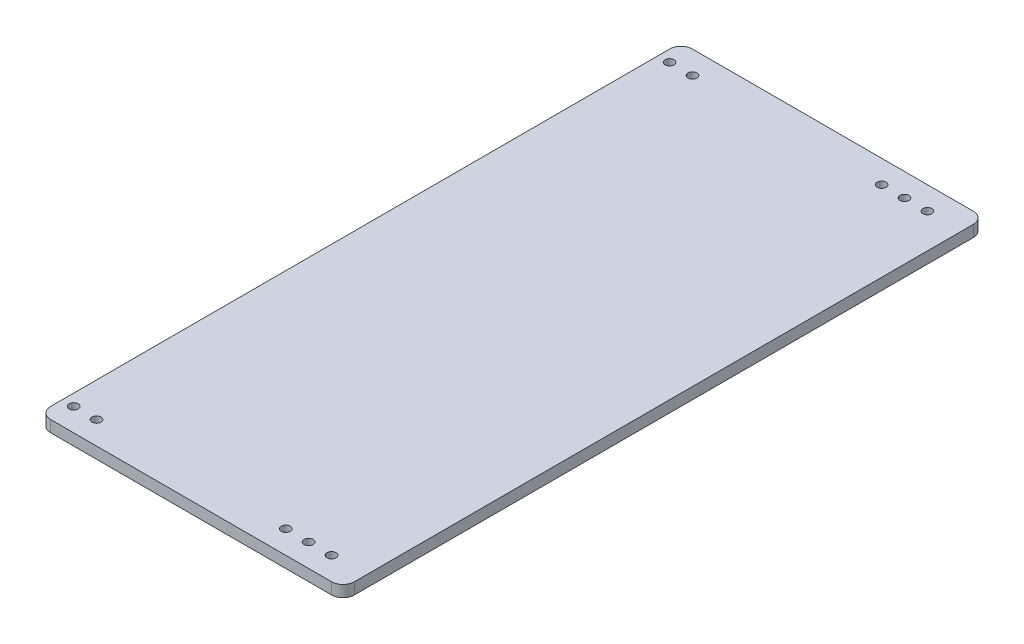
ISO-10303-21;
HEADER;
FILE_DESCRIPTION(('STEP AP214'),'2;1');
FILE_NAME('part.step','',(''),(''),'','','');
FILE_SCHEMA(('AUTOMOTIVE_DESIGN { 1 0 10303 214 1 1 1 1 }'));
ENDSEC;
DATA;
#1=APPLICATION_CONTEXT('core data for automotive mechanical design processes');
#2=APPLICATION_PROTOCOL_DEFINITION('international standard','automotive_design',2000,#1);
#3=PRODUCT_CONTEXT('',#1,'mechanical');
#4=PRODUCT('Part','Part','',(#3));
#5=PRODUCT_RELATED_PRODUCT_CATEGORY('part','',(#4));
#6=PRODUCT_DEFINITION_FORMATION('','',#4);
#7=PRODUCT_DEFINITION_CONTEXT('part definition',#1,'design');
#8=PRODUCT_DEFINITION('design','',#6,#7);
#9=PRODUCT_DEFINITION_SHAPE('','',#8);
#10=(LENGTH_UNIT() NAMED_UNIT(*) SI_UNIT(.MILLI.,.METRE.));
#11=(NAMED_UNIT(*) PLANE_ANGLE_UNIT() SI_UNIT($,.RADIAN.));
#12=(NAMED_UNIT(*) SI_UNIT($,.STERADIAN.) SOLID_ANGLE_UNIT());
#13=UNCERTAINTY_MEASURE_WITH_UNIT(LENGTH_MEASURE(1.E-05),#10,'distance_accuracy_value','');
#14=(GEOMETRIC_REPRESENTATION_CONTEXT(3) GLOBAL_UNCERTAINTY_ASSIGNED_CONTEXT((#13)) GLOBAL_UNIT_ASSIGNED_CONTEXT((#10,
#11,#12)) REPRESENTATION_CONTEXT('',''));
#15=CARTESIAN_POINT('',(0.,0.,0.));
#16=DIRECTION('',(0.,0.,1.));
#17=DIRECTION('',(1.,0.,0.));
#18=AXIS2_PLACEMENT_3D('',#15,#16,#17);
#19=CARTESIAN_POINT('',(0.,6.35,0.));
#20=DIRECTION('',(0.,-1.,0.));
#21=DIRECTION('',(0.,0.,-1.));
#22=AXIS2_PLACEMENT_3D('',#19,#20,#21);
#23=PLANE('',#22);
#24=CARTESIAN_POINT('',(39.6875,6.35,165.1));
#25=DIRECTION('',(0.,1.,0.));
#26=DIRECTION('',(0.,0.,1.));
#27=AXIS2_PLACEMENT_3D('',#24,#25,#26);
#28=CIRCLE('',#27,2.48920000000002);
#29=CARTESIAN_POINT('',(39.6875,6.35,167.5892));
#30=VERTEX_POINT('',#29);
#31=EDGE_CURVE('E223',#30,#30,#28,.T.);
#32=ORIENTED_EDGE('',*,*,#31,.F.);
#33=EDGE_LOOP('',(#32));
#34=FACE_BOUND('',#33,.T.);
#35=CARTESIAN_POINT('',(-77.7875,6.35,-165.1));
#36=DIRECTION('',(0.,1.,0.));
#37=DIRECTION('',(0.,0.,1.));
#38=AXIS2_PLACEMENT_3D('',#35,#36,#37);
#39=CIRCLE('',#38,2.48920000000002);
#40=CARTESIAN_POINT('',(-77.7875,6.35,-162.6108));
#41=VERTEX_POINT('',#40);
#42=EDGE_CURVE('E205',#41,#41,#39,.T.);
#43=ORIENTED_EDGE('',*,*,#42,.F.);
#44=EDGE_LOOP('',(#43));
#45=FACE_BOUND('',#44,.T.);
#46=CARTESIAN_POINT('',(-77.7874999999999,6.35,165.1));
#47=DIRECTION('',(0.,1.,0.));
#48=DIRECTION('',(0.,0.,1.));
#49=AXIS2_PLACEMENT_3D('',#46,#47,#48);
#50=CIRCLE('',#49,2.48920000000002);
#51=CARTESIAN_POINT('',(-77.7874999999999,6.35,167.5892));
#52=VERTEX_POINT('',#51);
#53=EDGE_CURVE('E187',#52,#52,#50,.F.);
#54=ORIENTED_EDGE('',*,*,#53,.T.);
#55=EDGE_LOOP('',(#54));
#56=FACE_BOUND('',#55,.T.);
#57=CARTESIAN_POINT('',(65.0875,6.35,-165.1));
#58=DIRECTION('',(0.,1.,0.));
#59=DIRECTION('',(0.,0.,1.));
#60=AXIS2_PLACEMENT_3D('',#57,#58,#59);
#61=CIRCLE('',#60,2.48920000000002);
#62=CARTESIAN_POINT('',(65.0875,6.35,-162.6108));
#63=VERTEX_POINT('',#62);
#64=EDGE_CURVE('E192',#63,#63,#61,.F.);
#65=ORIENTED_EDGE('',*,*,#64,.T.);
#66=EDGE_LOOP('',(#65));
#67=FACE_BOUND('',#66,.T.);
#68=CARTESIAN_POINT('',(52.3875,6.35,-165.1));
#69=DIRECTION('',(0.,1.,0.));
#70=DIRECTION('',(0.,0.,1.));
#71=AXIS2_PLACEMENT_3D('',#68,#69,#70);
#72=CIRCLE('',#71,2.48920000000002);
#73=CARTESIAN_POINT('',(52.3875,6.35,-162.6108));
#74=VERTEX_POINT('',#73);
#75=EDGE_CURVE('E193',#74,#74,#72,.F.);
#76=ORIENTED_EDGE('',*,*,#75,.T.);
#77=EDGE_LOOP('',(#76));
#78=FACE_BOUND('',#77,.T.);
#79=CARTESIAN_POINT('',(39.6875,6.35,-165.1));
#80=DIRECTION('',(0.,1.,0.));
#81=DIRECTION('',(0.,0.,1.));
#82=AXIS2_PLACEMENT_3D('',#79,#80,#81);
#83=CIRCLE('',#82,2.48920000000002);
#84=CARTESIAN_POINT('',(39.6875,6.35,-162.6108));
#85=VERTEX_POINT('',#84);
#86=EDGE_CURVE('E204',#85,#85,#83,.F.);
#87=ORIENTED_EDGE('',*,*,#86,.T.);
#88=EDGE_LOOP('',(#87));
#89=FACE_BOUND('',#88,.T.);
#90=DIRECTION('',(1.,0.,0.));
#91=VECTOR('',#90,1.);
#92=CARTESIAN_POINT('',(-84.1375,6.35,177.8));
#93=LINE('',#92,#91);
#94=CARTESIAN_POINT('',(-77.7875,6.35,177.8));
#95=VERTEX_POINT('',#94);
#96=CARTESIAN_POINT('',(77.7875,6.35,177.8));
#97=VERTEX_POINT('',#96);
#98=EDGE_CURVE('E142',#95,#97,#93,.T.);
#99=ORIENTED_EDGE('',*,*,#98,.T.);
#100=CARTESIAN_POINT('',(77.7875,6.35,171.45));
#101=DIRECTION('',(0.,-1.,0.));
#102=DIRECTION('',(0.,0.,-1.));
#103=AXIS2_PLACEMENT_3D('',#100,#101,#102);
#104=CIRCLE('',#103,6.35);
#105=CARTESIAN_POINT('',(84.1375,6.35,171.45));
#106=VERTEX_POINT('',#105);
#107=EDGE_CURVE('E161',#97,#106,#104,.F.);
#108=ORIENTED_EDGE('',*,*,#107,.T.);
#109=DIRECTION('',(0.,0.,-1.));
#110=VECTOR('',#109,1.);
#111=CARTESIAN_POINT('',(84.1375,6.35,177.8));
#112=LINE('',#111,#110);
#113=CARTESIAN_POINT('',(84.1375,6.35,-171.45));
#114=VERTEX_POINT('',#113);
#115=EDGE_CURVE('E125',#106,#114,#112,.T.);
#116=ORIENTED_EDGE('',*,*,#115,.T.);
#117=CARTESIAN_POINT('',(77.7875,6.35,-171.45));
#118=DIRECTION('',(0.,-1.,0.));
#119=DIRECTION('',(0.,0.,-1.));
#120=AXIS2_PLACEMENT_3D('',#117,#118,#119);
#121=CIRCLE('',#120,6.35);
#122=CARTESIAN_POINT('',(77.7875,6.35,-177.8));
#123=VERTEX_POINT('',#122);
#124=EDGE_CURVE('E156',#114,#123,#121,.F.);
#125=ORIENTED_EDGE('',*,*,#124,.T.);
#126=DIRECTION('',(-1.,0.,0.));
#127=VECTOR('',#126,1.);
#128=CARTESIAN_POINT('',(-84.1375,6.35,-177.8));
#129=LINE('',#128,#127);
#130=CARTESIAN_POINT('',(-77.7875,6.35,-177.8));
#131=VERTEX_POINT('',#130);
#132=EDGE_CURVE('E172',#123,#131,#129,.T.);
#133=ORIENTED_EDGE('',*,*,#132,.T.);
#134=CARTESIAN_POINT('',(-77.7875,6.35,-171.45));
#135=DIRECTION('',(0.,-1.,0.));
#136=DIRECTION('',(0.,0.,-1.));
#137=AXIS2_PLACEMENT_3D('',#134,#135,#136);
#138=CIRCLE('',#137,6.35);
#139=CARTESIAN_POINT('',(-84.1375,6.35,-171.45));
#140=VERTEX_POINT('',#139);
#141=EDGE_CURVE('E61',#131,#140,#138,.F.);
#142=ORIENTED_EDGE('',*,*,#141,.T.);
#143=DIRECTION('',(0.,0.,1.));
#144=VECTOR('',#143,1.);
#145=CARTESIAN_POINT('',(-84.1375,6.35,177.8));
#146=LINE('',#145,#144);
#147=CARTESIAN_POINT('',(-84.1375,6.35,171.45));
#148=VERTEX_POINT('',#147);
#149=EDGE_CURVE('E180',#140,#148,#146,.T.);
#150=ORIENTED_EDGE('',*,*,#149,.T.);
#151=CARTESIAN_POINT('',(-77.7875,6.35,171.45));
#152=DIRECTION('',(0.,-1.,0.));
#153=DIRECTION('',(0.,0.,-1.));
#154=AXIS2_PLACEMENT_3D('',#151,#152,#153);
#155=CIRCLE('',#154,6.35);
#156=EDGE_CURVE('E159',#148,#95,#155,.F.);
#157=ORIENTED_EDGE('',*,*,#156,.T.);
#158=EDGE_LOOP('',(#99,#108,#116,#125,#133,#142,#150,#157));
#159=FACE_BOUND('',#158,.T.);
#160=CARTESIAN_POINT('',(-65.0874999999999,6.35,165.1));
#161=DIRECTION('',(0.,1.,0.));
#162=DIRECTION('',(0.,0.,1.));
#163=AXIS2_PLACEMENT_3D('',#160,#161,#162);
#164=CIRCLE('',#163,2.48920000000002);
#165=CARTESIAN_POINT('',(-65.0874999999999,6.35,167.5892));
#166=VERTEX_POINT('',#165);
#167=EDGE_CURVE('E139',#166,#166,#164,.F.);
#168=ORIENTED_EDGE('',*,*,#167,.T.);
#169=EDGE_LOOP('',(#168));
#170=FACE_BOUND('',#169,.T.);
#171=CARTESIAN_POINT('',(65.0875,6.35,165.1));
#172=DIRECTION('',(0.,1.,0.));
#173=DIRECTION('',(0.,0.,1.));
#174=AXIS2_PLACEMENT_3D('',#171,#172,#173);
#175=CIRCLE('',#174,2.48920000000002);
#176=CARTESIAN_POINT('',(65.0875,6.35,167.5892));
#177=VERTEX_POINT('',#176);
#178=EDGE_CURVE('E217',#177,#177,#175,.T.);
#179=ORIENTED_EDGE('',*,*,#178,.F.);
#180=EDGE_LOOP('',(#179));
#181=FACE_BOUND('',#180,.T.);
#182=CARTESIAN_POINT('',(-65.0875,6.35,-165.1));
#183=DIRECTION('',(0.,1.,0.));
#184=DIRECTION('',(0.,0.,1.));
#185=AXIS2_PLACEMENT_3D('',#182,#183,#184);
#186=CIRCLE('',#185,2.48920000000002);
#187=CARTESIAN_POINT('',(-65.0875,6.35,-162.6108));
#188=VERTEX_POINT('',#187);
#189=EDGE_CURVE('E229',#188,#188,#186,.T.);
#190=ORIENTED_EDGE('',*,*,#189,.F.);
#191=EDGE_LOOP('',(#190));
#192=FACE_BOUND('',#191,.T.);
#193=CARTESIAN_POINT('',(52.3875,6.35,165.1));
#194=DIRECTION('',(0.,1.,0.));
#195=DIRECTION('',(0.,0.,1.));
#196=AXIS2_PLACEMENT_3D('',#193,#194,#195);
#197=CIRCLE('',#196,2.48920000000002);
#198=CARTESIAN_POINT('',(52.3875,6.35,167.5892));
#199=VERTEX_POINT('',#198);
#200=EDGE_CURVE('E216',#199,#199,#197,.T.);
#201=ORIENTED_EDGE('',*,*,#200,.F.);
#202=EDGE_LOOP('',(#201));
#203=FACE_BOUND('',#202,.T.);
#204=ADVANCED_FACE('F39',(#34,#45,#56,#67,#78,#89,#159,#170,#181,#192,#203),#23,.F.);
#205=CARTESIAN_POINT('',(0.,0.,0.));
#206=DIRECTION('',(0.,-1.,0.));
#207=DIRECTION('',(0.,0.,-1.));
#208=AXIS2_PLACEMENT_3D('',#205,#206,#207);
#209=PLANE('',#208);
#210=CARTESIAN_POINT('',(-77.7874999999999,0.,165.1));
#211=DIRECTION('',(0.,1.,0.));
#212=DIRECTION('',(0.,0.,1.));
#213=AXIS2_PLACEMENT_3D('',#210,#211,#212);
#214=CIRCLE('',#213,2.48920000000002);
#215=CARTESIAN_POINT('',(-77.7874999999999,0.,167.5892));
#216=VERTEX_POINT('',#215);
#217=EDGE_CURVE('E196',#216,#216,#214,.F.);
#218=ORIENTED_EDGE('',*,*,#217,.F.);
#219=EDGE_LOOP('',(#218));
#220=FACE_BOUND('',#219,.T.);
#221=CARTESIAN_POINT('',(65.0875,0.,-165.1));
#222=DIRECTION('',(0.,1.,0.));
#223=DIRECTION('',(0.,0.,1.));
#224=AXIS2_PLACEMENT_3D('',#221,#222,#223);
#225=CIRCLE('',#224,2.48920000000002);
#226=CARTESIAN_POINT('',(65.0875,0.,-162.6108));
#227=VERTEX_POINT('',#226);
#228=EDGE_CURVE('E189',#227,#227,#225,.F.);
#229=ORIENTED_EDGE('',*,*,#228,.F.);
#230=EDGE_LOOP('',(#229));
#231=FACE_BOUND('',#230,.T.);
#232=CARTESIAN_POINT('',(52.3875,0.,-165.1));
#233=DIRECTION('',(0.,1.,0.));
#234=DIRECTION('',(0.,0.,1.));
#235=AXIS2_PLACEMENT_3D('',#232,#233,#234);
#236=CIRCLE('',#235,2.48920000000002);
#237=CARTESIAN_POINT('',(52.3875,0.,-162.6108));
#238=VERTEX_POINT('',#237);
#239=EDGE_CURVE('E208',#238,#238,#236,.F.);
#240=ORIENTED_EDGE('',*,*,#239,.F.);
#241=EDGE_LOOP('',(#240));
#242=FACE_BOUND('',#241,.T.);
#243=CARTESIAN_POINT('',(39.6875,0.,-165.1));
#244=DIRECTION('',(0.,1.,0.));
#245=DIRECTION('',(0.,0.,1.));
#246=AXIS2_PLACEMENT_3D('',#243,#244,#245);
#247=CIRCLE('',#246,2.48920000000002);
#248=CARTESIAN_POINT('',(39.6875,0.,-162.6108));
#249=VERTEX_POINT('',#248);
#250=EDGE_CURVE('E201',#249,#249,#247,.F.);
#251=ORIENTED_EDGE('',*,*,#250,.F.);
#252=EDGE_LOOP('',(#251));
#253=FACE_BOUND('',#252,.T.);
#254=CARTESIAN_POINT('',(-65.0874999999999,0.,165.1));
#255=DIRECTION('',(0.,1.,0.));
#256=DIRECTION('',(0.,0.,1.));
#257=AXIS2_PLACEMENT_3D('',#254,#255,#256);
#258=CIRCLE('',#257,2.48920000000002);
#259=CARTESIAN_POINT('',(-65.0874999999999,0.,167.5892));
#260=VERTEX_POINT('',#259);
#261=EDGE_CURVE('E133',#260,#260,#258,.F.);
#262=ORIENTED_EDGE('',*,*,#261,.F.);
#263=EDGE_LOOP('',(#262));
#264=FACE_BOUND('',#263,.T.);
#265=DIRECTION('',(0.,0.,-1.));
#266=VECTOR('',#265,1.);
#267=CARTESIAN_POINT('',(84.1375,0.,177.8));
#268=LINE('',#267,#266);
#269=CARTESIAN_POINT('',(84.1375,0.,171.45));
#270=VERTEX_POINT('',#269);
#271=CARTESIAN_POINT('',(84.1375,0.,-171.45));
#272=VERTEX_POINT('',#271);
#273=EDGE_CURVE('E122',#270,#272,#268,.T.);
#274=ORIENTED_EDGE('',*,*,#273,.F.);
#275=CARTESIAN_POINT('',(77.7875,0.,171.45));
#276=DIRECTION('',(0.,-1.,0.));
#277=DIRECTION('',(0.,0.,-1.));
#278=AXIS2_PLACEMENT_3D('',#275,#276,#277);
#279=CIRCLE('',#278,6.35);
#280=CARTESIAN_POINT('',(77.7875,0.,177.8));
#281=VERTEX_POINT('',#280);
#282=EDGE_CURVE('E105',#270,#281,#279,.T.);
#283=ORIENTED_EDGE('',*,*,#282,.T.);
#284=DIRECTION('',(1.,0.,0.));
#285=VECTOR('',#284,1.);
#286=CARTESIAN_POINT('',(-84.1375,0.,177.8));
#287=LINE('',#286,#285);
#288=CARTESIAN_POINT('',(-77.7875,0.,177.8));
#289=VERTEX_POINT('',#288);
#290=EDGE_CURVE('E146',#289,#281,#287,.T.);
#291=ORIENTED_EDGE('',*,*,#290,.F.);
#292=CARTESIAN_POINT('',(-77.7875,0.,171.45));
#293=DIRECTION('',(0.,-1.,0.));
#294=DIRECTION('',(0.,0.,-1.));
#295=AXIS2_PLACEMENT_3D('',#292,#293,#294);
#296=CIRCLE('',#295,6.35);
#297=CARTESIAN_POINT('',(-84.1375,0.,171.45));
#298=VERTEX_POINT('',#297);
#299=EDGE_CURVE('E116',#289,#298,#296,.T.);
#300=ORIENTED_EDGE('',*,*,#299,.T.);
#301=DIRECTION('',(0.,0.,1.));
#302=VECTOR('',#301,1.);
#303=CARTESIAN_POINT('',(-84.1375,0.,177.8));
#304=LINE('',#303,#302);
#305=CARTESIAN_POINT('',(-84.1375,0.,-171.45));
#306=VERTEX_POINT('',#305);
#307=EDGE_CURVE('E136',#306,#298,#304,.T.);
#308=ORIENTED_EDGE('',*,*,#307,.F.);
#309=CARTESIAN_POINT('',(-77.7875,0.,-171.45));
#310=DIRECTION('',(0.,-1.,0.));
#311=DIRECTION('',(0.,0.,-1.));
#312=AXIS2_PLACEMENT_3D('',#309,#310,#311);
#313=CIRCLE('',#312,6.35);
#314=CARTESIAN_POINT('',(-77.7875,0.,-177.8));
#315=VERTEX_POINT('',#314);
#316=EDGE_CURVE('E150',#306,#315,#313,.T.);
#317=ORIENTED_EDGE('',*,*,#316,.T.);
#318=DIRECTION('',(-1.,0.,0.));
#319=VECTOR('',#318,1.);
#320=CARTESIAN_POINT('',(-84.1375,0.,-177.8));
#321=LINE('',#320,#319);
#322=CARTESIAN_POINT('',(77.7875,0.,-177.8));
#323=VERTEX_POINT('',#322);
#324=EDGE_CURVE('E132',#323,#315,#321,.T.);
#325=ORIENTED_EDGE('',*,*,#324,.F.);
#326=CARTESIAN_POINT('',(77.7875,0.,-171.45));
#327=DIRECTION('',(0.,-1.,0.));
#328=DIRECTION('',(0.,0.,-1.));
#329=AXIS2_PLACEMENT_3D('',#326,#327,#328);
#330=CIRCLE('',#329,6.35);
#331=EDGE_CURVE('E126',#323,#272,#330,.T.);
#332=ORIENTED_EDGE('',*,*,#331,.T.);
#333=EDGE_LOOP('',(#274,#283,#291,#300,#308,#317,#325,#332));
#334=FACE_BOUND('',#333,.T.);
#335=CARTESIAN_POINT('',(65.0875,0.,165.1));
#336=DIRECTION('',(0.,1.,0.));
#337=DIRECTION('',(0.,0.,1.));
#338=AXIS2_PLACEMENT_3D('',#335,#336,#337);
#339=CIRCLE('',#338,2.48920000000002);
#340=CARTESIAN_POINT('',(65.0875,0.,167.5892));
#341=VERTEX_POINT('',#340);
#342=EDGE_CURVE('E237',#341,#341,#339,.T.);
#343=ORIENTED_EDGE('',*,*,#342,.T.);
#344=EDGE_LOOP('',(#343));
#345=FACE_BOUND('',#344,.T.);
#346=CARTESIAN_POINT('',(-77.7875,0.,-165.1));
#347=DIRECTION('',(0.,1.,0.));
#348=DIRECTION('',(0.,0.,1.));
#349=AXIS2_PLACEMENT_3D('',#346,#347,#348);
#350=CIRCLE('',#349,2.48920000000002);
#351=CARTESIAN_POINT('',(-77.7875,0.,-162.6108));
#352=VERTEX_POINT('',#351);
#353=EDGE_CURVE('E232',#352,#352,#350,.T.);
#354=ORIENTED_EDGE('',*,*,#353,.T.);
#355=EDGE_LOOP('',(#354));
#356=FACE_BOUND('',#355,.T.);
#357=CARTESIAN_POINT('',(-65.0875,0.,-165.1));
#358=DIRECTION('',(0.,1.,0.));
#359=DIRECTION('',(0.,0.,1.));
#360=AXIS2_PLACEMENT_3D('',#357,#358,#359);
#361=CIRCLE('',#360,2.48920000000002);
#362=CARTESIAN_POINT('',(-65.0875,0.,-162.6108));
#363=VERTEX_POINT('',#362);
#364=EDGE_CURVE('E226',#363,#363,#361,.T.);
#365=ORIENTED_EDGE('',*,*,#364,.T.);
#366=EDGE_LOOP('',(#365));
#367=FACE_BOUND('',#366,.T.);
#368=CARTESIAN_POINT('',(39.6875,0.,165.1));
#369=DIRECTION('',(0.,1.,0.));
#370=DIRECTION('',(0.,0.,1.));
#371=AXIS2_PLACEMENT_3D('',#368,#369,#370);
#372=CIRCLE('',#371,2.48920000000002);
#373=CARTESIAN_POINT('',(39.6875,0.,167.5892));
#374=VERTEX_POINT('',#373);
#375=EDGE_CURVE('E220',#374,#374,#372,.T.);
#376=ORIENTED_EDGE('',*,*,#375,.T.);
#377=EDGE_LOOP('',(#376));
#378=FACE_BOUND('',#377,.T.);
#379=CARTESIAN_POINT('',(52.3875,0.,165.1));
#380=DIRECTION('',(0.,1.,0.));
#381=DIRECTION('',(0.,0.,1.));
#382=AXIS2_PLACEMENT_3D('',#379,#380,#381);
#383=CIRCLE('',#382,2.48920000000002);
#384=CARTESIAN_POINT('',(52.3875,0.,167.5892));
#385=VERTEX_POINT('',#384);
#386=EDGE_CURVE('E213',#385,#385,#383,.T.);
#387=ORIENTED_EDGE('',*,*,#386,.T.);
#388=EDGE_LOOP('',(#387));
#389=FACE_BOUND('',#388,.T.);
#390=ADVANCED_FACE('F129',(#220,#231,#242,#253,#264,#334,#345,#356,#367,#378,#389),#209,.T.);
#391=CARTESIAN_POINT('',(84.1375,6.35,177.8));
#392=DIRECTION('',(-1.,0.,0.));
#393=DIRECTION('',(0.,0.,1.));
#394=AXIS2_PLACEMENT_3D('',#391,#392,#393);
#395=PLANE('',#394);
#396=ORIENTED_EDGE('',*,*,#115,.F.);
#397=DIRECTION('',(0.,-1.,0.));
#398=VECTOR('',#397,1.);
#399=CARTESIAN_POINT('',(84.1375,6.35,171.45));
#400=LINE('',#399,#398);
#401=EDGE_CURVE('E109',#106,#270,#400,.T.);
#402=ORIENTED_EDGE('',*,*,#401,.T.);
#403=ORIENTED_EDGE('',*,*,#273,.T.);
#404=DIRECTION('',(0.,-1.,0.));
#405=VECTOR('',#404,1.);
#406=CARTESIAN_POINT('',(84.1375,6.35,-171.45));
#407=LINE('',#406,#405);
#408=EDGE_CURVE('E127',#272,#114,#407,.F.);
#409=ORIENTED_EDGE('',*,*,#408,.T.);
#410=EDGE_LOOP('',(#396,#402,#403,#409));
#411=FACE_BOUND('',#410,.T.);
#412=ADVANCED_FACE('F121',(#411),#395,.F.);
#413=CARTESIAN_POINT('',(-84.1375,6.35,-177.8));
#414=DIRECTION('',(0.,0.,1.));
#415=DIRECTION('',(1.,0.,0.));
#416=AXIS2_PLACEMENT_3D('',#413,#414,#415);
#417=PLANE('',#416);
#418=ORIENTED_EDGE('',*,*,#324,.T.);
#419=DIRECTION('',(0.,-1.,0.));
#420=VECTOR('',#419,1.);
#421=CARTESIAN_POINT('',(-77.7875,6.35,-177.8));
#422=LINE('',#421,#420);
#423=EDGE_CURVE('E11',#315,#131,#422,.F.);
#424=ORIENTED_EDGE('',*,*,#423,.T.);
#425=ORIENTED_EDGE('',*,*,#132,.F.);
#426=DIRECTION('',(0.,-1.,0.));
#427=VECTOR('',#426,1.);
#428=CARTESIAN_POINT('',(77.7875,6.35,-177.8));
#429=LINE('',#428,#427);
#430=EDGE_CURVE('E47',#123,#323,#429,.T.);
#431=ORIENTED_EDGE('',*,*,#430,.T.);
#432=EDGE_LOOP('',(#418,#424,#425,#431));
#433=FACE_BOUND('',#432,.T.);
#434=ADVANCED_FACE('F170',(#433),#417,.F.);
#435=CARTESIAN_POINT('',(-84.1375,6.35,177.8));
#436=DIRECTION('',(1.,0.,0.));
#437=DIRECTION('',(0.,0.,-1.));
#438=AXIS2_PLACEMENT_3D('',#435,#436,#437);
#439=PLANE('',#438);
#440=ORIENTED_EDGE('',*,*,#307,.T.);
#441=DIRECTION('',(0.,-1.,0.));
#442=VECTOR('',#441,1.);
#443=CARTESIAN_POINT('',(-84.1375,6.35,171.45));
#444=LINE('',#443,#442);
#445=EDGE_CURVE('E54',#298,#148,#444,.F.);
#446=ORIENTED_EDGE('',*,*,#445,.T.);
#447=ORIENTED_EDGE('',*,*,#149,.F.);
#448=DIRECTION('',(0.,-1.,0.));
#449=VECTOR('',#448,1.);
#450=CARTESIAN_POINT('',(-84.1375,6.35,-171.45));
#451=LINE('',#450,#449);
#452=EDGE_CURVE('E163',#140,#306,#451,.T.);
#453=ORIENTED_EDGE('',*,*,#452,.T.);
#454=EDGE_LOOP('',(#440,#446,#447,#453));
#455=FACE_BOUND('',#454,.T.);
#456=ADVANCED_FACE('F179',(#455),#439,.F.);
#457=CARTESIAN_POINT('',(-84.1375,6.35,177.8));
#458=DIRECTION('',(0.,0.,-1.));
#459=DIRECTION('',(-1.,0.,0.));
#460=AXIS2_PLACEMENT_3D('',#457,#458,#459);
#461=PLANE('',#460);
#462=ORIENTED_EDGE('',*,*,#290,.T.);
#463=DIRECTION('',(0.,-1.,0.));
#464=VECTOR('',#463,1.);
#465=CARTESIAN_POINT('',(77.7875,6.35,177.8));
#466=LINE('',#465,#464);
#467=EDGE_CURVE('E110',#281,#97,#466,.F.);
#468=ORIENTED_EDGE('',*,*,#467,.T.);
#469=ORIENTED_EDGE('',*,*,#98,.F.);
#470=DIRECTION('',(0.,-1.,0.));
#471=VECTOR('',#470,1.);
#472=CARTESIAN_POINT('',(-77.7875,6.35,177.8));
#473=LINE('',#472,#471);
#474=EDGE_CURVE('E115',#95,#289,#473,.T.);
#475=ORIENTED_EDGE('',*,*,#474,.T.);
#476=EDGE_LOOP('',(#462,#468,#469,#475));
#477=FACE_BOUND('',#476,.T.);
#478=ADVANCED_FACE('F289',(#477),#461,.F.);
#479=CARTESIAN_POINT('',(-65.0874999999999,0.,165.1));
#480=DIRECTION('',(0.,1.,0.));
#481=DIRECTION('',(0.,0.,1.));
#482=AXIS2_PLACEMENT_3D('',#479,#480,#481);
#483=CYLINDRICAL_SURFACE('',#482,2.48920000000002);
#484=ORIENTED_EDGE('',*,*,#261,.T.);
#485=EDGE_LOOP('',(#484));
#486=FACE_BOUND('',#485,.T.);
#487=ORIENTED_EDGE('',*,*,#167,.F.);
#488=EDGE_LOOP('',(#487));
#489=FACE_BOUND('',#488,.T.);
#490=ADVANCED_FACE('F287',(#486,#489),#483,.F.);
#491=CARTESIAN_POINT('',(65.0875,0.,165.1));
#492=DIRECTION('',(0.,1.,0.));
#493=DIRECTION('',(0.,0.,1.));
#494=AXIS2_PLACEMENT_3D('',#491,#492,#493);
#495=CYLINDRICAL_SURFACE('',#494,2.48920000000002);
#496=ORIENTED_EDGE('',*,*,#342,.F.);
#497=EDGE_LOOP('',(#496));
#498=FACE_BOUND('',#497,.T.);
#499=ORIENTED_EDGE('',*,*,#178,.T.);
#500=EDGE_LOOP('',(#499));
#501=FACE_BOUND('',#500,.T.);
#502=ADVANCED_FACE('F243',(#498,#501),#495,.F.);
#503=CARTESIAN_POINT('',(39.6875,0.,-165.1));
#504=DIRECTION('',(0.,1.,0.));
#505=DIRECTION('',(0.,0.,1.));
#506=AXIS2_PLACEMENT_3D('',#503,#504,#505);
#507=CYLINDRICAL_SURFACE('',#506,2.48920000000002);
#508=ORIENTED_EDGE('',*,*,#250,.T.);
#509=EDGE_LOOP('',(#508));
#510=FACE_BOUND('',#509,.T.);
#511=ORIENTED_EDGE('',*,*,#86,.F.);
#512=EDGE_LOOP('',(#511));
#513=FACE_BOUND('',#512,.T.);
#514=ADVANCED_FACE('F274',(#510,#513),#507,.F.);
#515=CARTESIAN_POINT('',(52.3875,0.,-165.1));
#516=DIRECTION('',(0.,1.,0.));
#517=DIRECTION('',(0.,0.,1.));
#518=AXIS2_PLACEMENT_3D('',#515,#516,#517);
#519=CYLINDRICAL_SURFACE('',#518,2.48920000000002);
#520=ORIENTED_EDGE('',*,*,#239,.T.);
#521=EDGE_LOOP('',(#520));
#522=FACE_BOUND('',#521,.T.);
#523=ORIENTED_EDGE('',*,*,#75,.F.);
#524=EDGE_LOOP('',(#523));
#525=FACE_BOUND('',#524,.T.);
#526=ADVANCED_FACE('F270',(#522,#525),#519,.F.);
#527=CARTESIAN_POINT('',(65.0875,0.,-165.1));
#528=DIRECTION('',(0.,1.,0.));
#529=DIRECTION('',(0.,0.,1.));
#530=AXIS2_PLACEMENT_3D('',#527,#528,#529);
#531=CYLINDRICAL_SURFACE('',#530,2.48920000000002);
#532=ORIENTED_EDGE('',*,*,#228,.T.);
#533=EDGE_LOOP('',(#532));
#534=FACE_BOUND('',#533,.T.);
#535=ORIENTED_EDGE('',*,*,#64,.F.);
#536=EDGE_LOOP('',(#535));
#537=FACE_BOUND('',#536,.T.);
#538=ADVANCED_FACE('F273',(#534,#537),#531,.F.);
#539=CARTESIAN_POINT('',(-77.7874999999999,0.,165.1));
#540=DIRECTION('',(0.,1.,0.));
#541=DIRECTION('',(0.,0.,1.));
#542=AXIS2_PLACEMENT_3D('',#539,#540,#541);
#543=CYLINDRICAL_SURFACE('',#542,2.48920000000002);
#544=ORIENTED_EDGE('',*,*,#217,.T.);
#545=EDGE_LOOP('',(#544));
#546=FACE_BOUND('',#545,.T.);
#547=ORIENTED_EDGE('',*,*,#53,.F.);
#548=EDGE_LOOP('',(#547));
#549=FACE_BOUND('',#548,.T.);
#550=ADVANCED_FACE('F279',(#546,#549),#543,.F.);
#551=CARTESIAN_POINT('',(-77.7875,0.,-165.1));
#552=DIRECTION('',(0.,1.,0.));
#553=DIRECTION('',(0.,0.,1.));
#554=AXIS2_PLACEMENT_3D('',#551,#552,#553);
#555=CYLINDRICAL_SURFACE('',#554,2.48920000000002);
#556=ORIENTED_EDGE('',*,*,#353,.F.);
#557=EDGE_LOOP('',(#556));
#558=FACE_BOUND('',#557,.T.);
#559=ORIENTED_EDGE('',*,*,#42,.T.);
#560=EDGE_LOOP('',(#559));
#561=FACE_BOUND('',#560,.T.);
#562=ADVANCED_FACE('F282',(#558,#561),#555,.F.);
#563=CARTESIAN_POINT('',(-65.0875,0.,-165.1));
#564=DIRECTION('',(0.,1.,0.));
#565=DIRECTION('',(0.,0.,1.));
#566=AXIS2_PLACEMENT_3D('',#563,#564,#565);
#567=CYLINDRICAL_SURFACE('',#566,2.48920000000002);
#568=ORIENTED_EDGE('',*,*,#364,.F.);
#569=EDGE_LOOP('',(#568));
#570=FACE_BOUND('',#569,.T.);
#571=ORIENTED_EDGE('',*,*,#189,.T.);
#572=EDGE_LOOP('',(#571));
#573=FACE_BOUND('',#572,.T.);
#574=ADVANCED_FACE('F264',(#570,#573),#567,.F.);
#575=CARTESIAN_POINT('',(39.6875,0.,165.1));
#576=DIRECTION('',(0.,1.,0.));
#577=DIRECTION('',(0.,0.,1.));
#578=AXIS2_PLACEMENT_3D('',#575,#576,#577);
#579=CYLINDRICAL_SURFACE('',#578,2.48920000000002);
#580=ORIENTED_EDGE('',*,*,#375,.F.);
#581=EDGE_LOOP('',(#580));
#582=FACE_BOUND('',#581,.T.);
#583=ORIENTED_EDGE('',*,*,#31,.T.);
#584=EDGE_LOOP('',(#583));
#585=FACE_BOUND('',#584,.T.);
#586=ADVANCED_FACE('F255',(#582,#585),#579,.F.);
#587=CARTESIAN_POINT('',(52.3875,0.,165.1));
#588=DIRECTION('',(0.,1.,0.));
#589=DIRECTION('',(0.,0.,1.));
#590=AXIS2_PLACEMENT_3D('',#587,#588,#589);
#591=CYLINDRICAL_SURFACE('',#590,2.48920000000002);
#592=ORIENTED_EDGE('',*,*,#386,.F.);
#593=EDGE_LOOP('',(#592));
#594=FACE_BOUND('',#593,.T.);
#595=ORIENTED_EDGE('',*,*,#200,.T.);
#596=EDGE_LOOP('',(#595));
#597=FACE_BOUND('',#596,.T.);
#598=ADVANCED_FACE('F253',(#594,#597),#591,.F.);
#599=CARTESIAN_POINT('',(77.7875,6.35,171.45));
#600=DIRECTION('',(0.,-1.,0.));
#601=DIRECTION('',(0.,0.,-1.));
#602=AXIS2_PLACEMENT_3D('',#599,#600,#601);
#603=CYLINDRICAL_SURFACE('',#602,6.35);
#604=ORIENTED_EDGE('',*,*,#107,.F.);
#605=ORIENTED_EDGE('',*,*,#467,.F.);
#606=ORIENTED_EDGE('',*,*,#282,.F.);
#607=ORIENTED_EDGE('',*,*,#401,.F.);
#608=EDGE_LOOP('',(#604,#605,#606,#607));
#609=FACE_BOUND('',#608,.T.);
#610=ADVANCED_FACE('F108',(#609),#603,.T.);
#611=CARTESIAN_POINT('',(-77.7875,6.35,171.45));
#612=DIRECTION('',(0.,-1.,0.));
#613=DIRECTION('',(0.,0.,-1.));
#614=AXIS2_PLACEMENT_3D('',#611,#612,#613);
#615=CYLINDRICAL_SURFACE('',#614,6.35);
#616=ORIENTED_EDGE('',*,*,#156,.F.);
#617=ORIENTED_EDGE('',*,*,#445,.F.);
#618=ORIENTED_EDGE('',*,*,#299,.F.);
#619=ORIENTED_EDGE('',*,*,#474,.F.);
#620=EDGE_LOOP('',(#616,#617,#618,#619));
#621=FACE_BOUND('',#620,.T.);
#622=ADVANCED_FACE('F262',(#621),#615,.T.);
#623=CARTESIAN_POINT('',(-77.7875,6.35,-171.45));
#624=DIRECTION('',(0.,-1.,0.));
#625=DIRECTION('',(0.,0.,-1.));
#626=AXIS2_PLACEMENT_3D('',#623,#624,#625);
#627=CYLINDRICAL_SURFACE('',#626,6.35);
#628=ORIENTED_EDGE('',*,*,#141,.F.);
#629=ORIENTED_EDGE('',*,*,#423,.F.);
#630=ORIENTED_EDGE('',*,*,#316,.F.);
#631=ORIENTED_EDGE('',*,*,#452,.F.);
#632=EDGE_LOOP('',(#628,#629,#630,#631));
#633=FACE_BOUND('',#632,.T.);
#634=ADVANCED_FACE('F178',(#633),#627,.T.);
#635=CARTESIAN_POINT('',(77.7875,6.35,-171.45));
#636=DIRECTION('',(0.,-1.,0.));
#637=DIRECTION('',(0.,0.,-1.));
#638=AXIS2_PLACEMENT_3D('',#635,#636,#637);
#639=CYLINDRICAL_SURFACE('',#638,6.35);
#640=ORIENTED_EDGE('',*,*,#124,.F.);
#641=ORIENTED_EDGE('',*,*,#408,.F.);
#642=ORIENTED_EDGE('',*,*,#331,.F.);
#643=ORIENTED_EDGE('',*,*,#430,.F.);
#644=EDGE_LOOP('',(#640,#641,#642,#643));
#645=FACE_BOUND('',#644,.T.);
#646=ADVANCED_FACE('F41',(#645),#639,.T.);
#647=CLOSED_SHELL('',(#204,#390,#412,#434,#456,#478,#490,#502,#514,#526,#538,#550,#562,#574,
#586,#598,#610,#622,#634,#646));
#648=MANIFOLD_SOLID_BREP('B2',#647);
#649=ADVANCED_BREP_SHAPE_REPRESENTATION('',(#18,#648),#14);
#650=SHAPE_DEFINITION_REPRESENTATION(#9,#649);
ENDSEC;
END-ISO-10303-21;
